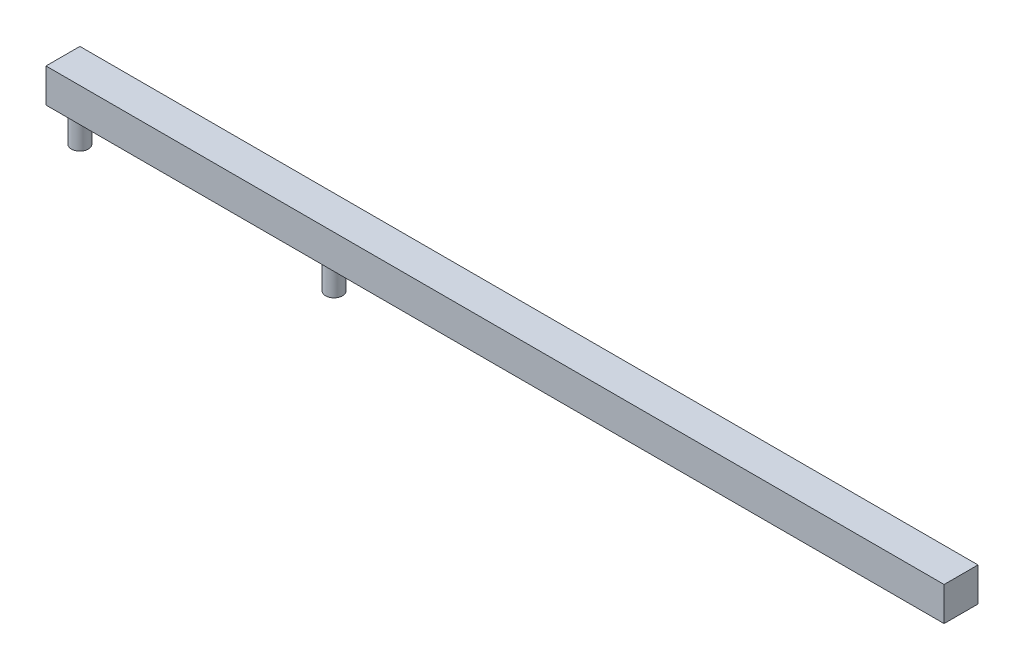
ISO-10303-21;
HEADER;
FILE_DESCRIPTION(('STEP AP214'),'2;1');
FILE_NAME('part.step','',(''),(''),'','','');
FILE_SCHEMA(('AUTOMOTIVE_DESIGN { 1 0 10303 214 1 1 1 1 }'));
ENDSEC;
DATA;
#1=APPLICATION_CONTEXT('core data for automotive mechanical design processes');
#2=APPLICATION_PROTOCOL_DEFINITION('international standard','automotive_design',2000,#1);
#3=PRODUCT_CONTEXT('',#1,'mechanical');
#4=PRODUCT('Part','Part','',(#3));
#5=PRODUCT_RELATED_PRODUCT_CATEGORY('part','',(#4));
#6=PRODUCT_DEFINITION_FORMATION('','',#4);
#7=PRODUCT_DEFINITION_CONTEXT('part definition',#1,'design');
#8=PRODUCT_DEFINITION('design','',#6,#7);
#9=PRODUCT_DEFINITION_SHAPE('','',#8);
#10=(LENGTH_UNIT() NAMED_UNIT(*) SI_UNIT(.MILLI.,.METRE.));
#11=(NAMED_UNIT(*) PLANE_ANGLE_UNIT() SI_UNIT($,.RADIAN.));
#12=(NAMED_UNIT(*) SI_UNIT($,.STERADIAN.) SOLID_ANGLE_UNIT());
#13=UNCERTAINTY_MEASURE_WITH_UNIT(LENGTH_MEASURE(1.E-05),#10,'distance_accuracy_value','');
#14=(GEOMETRIC_REPRESENTATION_CONTEXT(3) GLOBAL_UNCERTAINTY_ASSIGNED_CONTEXT((#13)) GLOBAL_UNIT_ASSIGNED_CONTEXT((#10,
#11,#12)) REPRESENTATION_CONTEXT('',''));
#15=CARTESIAN_POINT('',(0.,0.,0.));
#16=DIRECTION('',(0.,0.,1.));
#17=DIRECTION('',(1.,0.,0.));
#18=AXIS2_PLACEMENT_3D('',#15,#16,#17);
#19=CARTESIAN_POINT('',(0.,10.,0.));
#20=DIRECTION('',(-1.,0.,0.));
#21=DIRECTION('',(0.,0.,1.));
#22=AXIS2_PLACEMENT_3D('',#19,#20,#21);
#23=PLANE('',#22);
#24=DIRECTION('',(0.,0.,-1.));
#25=VECTOR('',#24,1.);
#26=CARTESIAN_POINT('',(0.,0.,0.));
#27=LINE('',#26,#25);
#28=CARTESIAN_POINT('',(0.,0.,10.));
#29=VERTEX_POINT('',#28);
#30=CARTESIAN_POINT('',(0.,0.,0.));
#31=VERTEX_POINT('',#30);
#32=EDGE_CURVE('E96',#29,#31,#27,.T.);
#33=ORIENTED_EDGE('',*,*,#32,.T.);
#34=DIRECTION('',(0.,-1.,0.));
#35=VECTOR('',#34,1.);
#36=CARTESIAN_POINT('',(0.,10.,0.));
#37=LINE('',#36,#35);
#38=CARTESIAN_POINT('',(0.,10.,0.));
#39=VERTEX_POINT('',#38);
#40=EDGE_CURVE('E11',#39,#31,#37,.T.);
#41=ORIENTED_EDGE('',*,*,#40,.F.);
#42=DIRECTION('',(0.,0.,-1.));
#43=VECTOR('',#42,1.);
#44=CARTESIAN_POINT('',(0.,10.,0.));
#45=LINE('',#44,#43);
#46=CARTESIAN_POINT('',(0.,10.,10.));
#47=VERTEX_POINT('',#46);
#48=EDGE_CURVE('E84',#47,#39,#45,.T.);
#49=ORIENTED_EDGE('',*,*,#48,.F.);
#50=DIRECTION('',(0.,-1.,0.));
#51=VECTOR('',#50,1.);
#52=CARTESIAN_POINT('',(0.,10.,10.));
#53=LINE('',#52,#51);
#54=EDGE_CURVE('E92',#47,#29,#53,.T.);
#55=ORIENTED_EDGE('',*,*,#54,.T.);
#56=EDGE_LOOP('',(#33,#41,#49,#55));
#57=FACE_BOUND('',#56,.T.);
#58=ADVANCED_FACE('F33',(#57),#23,.F.);
#59=CARTESIAN_POINT('',(0.,10.,0.));
#60=DIRECTION('',(0.,0.,1.));
#61=DIRECTION('',(1.,0.,0.));
#62=AXIS2_PLACEMENT_3D('',#59,#60,#61);
#63=PLANE('',#62);
#64=DIRECTION('',(-1.,0.,0.));
#65=VECTOR('',#64,1.);
#66=CARTESIAN_POINT('',(0.,0.,0.));
#67=LINE('',#66,#65);
#68=CARTESIAN_POINT('',(-265.,0.,0.));
#69=VERTEX_POINT('',#68);
#70=EDGE_CURVE('E88',#31,#69,#67,.T.);
#71=ORIENTED_EDGE('',*,*,#70,.T.);
#72=DIRECTION('',(0.,-1.,0.));
#73=VECTOR('',#72,1.);
#74=CARTESIAN_POINT('',(-265.,10.,0.));
#75=LINE('',#74,#73);
#76=CARTESIAN_POINT('',(-265.,10.,0.));
#77=VERTEX_POINT('',#76);
#78=EDGE_CURVE('E41',#77,#69,#75,.T.);
#79=ORIENTED_EDGE('',*,*,#78,.F.);
#80=DIRECTION('',(-1.,0.,0.));
#81=VECTOR('',#80,1.);
#82=CARTESIAN_POINT('',(0.,10.,0.));
#83=LINE('',#82,#81);
#84=EDGE_CURVE('E79',#39,#77,#83,.T.);
#85=ORIENTED_EDGE('',*,*,#84,.F.);
#86=ORIENTED_EDGE('',*,*,#40,.T.);
#87=EDGE_LOOP('',(#71,#79,#85,#86));
#88=FACE_BOUND('',#87,.T.);
#89=ADVANCED_FACE('F87',(#88),#63,.F.);
#90=CARTESIAN_POINT('',(-265.,10.,0.));
#91=DIRECTION('',(1.,0.,0.));
#92=DIRECTION('',(0.,0.,-1.));
#93=AXIS2_PLACEMENT_3D('',#90,#91,#92);
#94=PLANE('',#93);
#95=DIRECTION('',(0.,0.,1.));
#96=VECTOR('',#95,1.);
#97=CARTESIAN_POINT('',(-265.,0.,0.));
#98=LINE('',#97,#96);
#99=CARTESIAN_POINT('',(-265.,0.,10.));
#100=VERTEX_POINT('',#99);
#101=EDGE_CURVE('E66',#69,#100,#98,.T.);
#102=ORIENTED_EDGE('',*,*,#101,.T.);
#103=DIRECTION('',(0.,-1.,0.));
#104=VECTOR('',#103,1.);
#105=CARTESIAN_POINT('',(-265.,10.,10.));
#106=LINE('',#105,#104);
#107=CARTESIAN_POINT('',(-265.,10.,10.));
#108=VERTEX_POINT('',#107);
#109=EDGE_CURVE('E89',#108,#100,#106,.T.);
#110=ORIENTED_EDGE('',*,*,#109,.F.);
#111=DIRECTION('',(0.,0.,1.));
#112=VECTOR('',#111,1.);
#113=CARTESIAN_POINT('',(-265.,10.,0.));
#114=LINE('',#113,#112);
#115=EDGE_CURVE('E82',#77,#108,#114,.T.);
#116=ORIENTED_EDGE('',*,*,#115,.F.);
#117=ORIENTED_EDGE('',*,*,#78,.T.);
#118=EDGE_LOOP('',(#102,#110,#116,#117));
#119=FACE_BOUND('',#118,.T.);
#120=ADVANCED_FACE('F90',(#119),#94,.F.);
#121=CARTESIAN_POINT('',(0.,10.,10.));
#122=DIRECTION('',(0.,0.,-1.));
#123=DIRECTION('',(-1.,0.,0.));
#124=AXIS2_PLACEMENT_3D('',#121,#122,#123);
#125=PLANE('',#124);
#126=DIRECTION('',(1.,0.,0.));
#127=VECTOR('',#126,1.);
#128=CARTESIAN_POINT('',(0.,0.,10.));
#129=LINE('',#128,#127);
#130=EDGE_CURVE('E72',#100,#29,#129,.T.);
#131=ORIENTED_EDGE('',*,*,#130,.T.);
#132=ORIENTED_EDGE('',*,*,#54,.F.);
#133=DIRECTION('',(1.,0.,0.));
#134=VECTOR('',#133,1.);
#135=CARTESIAN_POINT('',(0.,10.,10.));
#136=LINE('',#135,#134);
#137=EDGE_CURVE('E49',#108,#47,#136,.T.);
#138=ORIENTED_EDGE('',*,*,#137,.F.);
#139=ORIENTED_EDGE('',*,*,#109,.T.);
#140=EDGE_LOOP('',(#131,#132,#138,#139));
#141=FACE_BOUND('',#140,.T.);
#142=ADVANCED_FACE('F104',(#141),#125,.F.);
#143=CARTESIAN_POINT('',(0.,10.,0.));
#144=DIRECTION('',(0.,-1.,0.));
#145=DIRECTION('',(0.,0.,-1.));
#146=AXIS2_PLACEMENT_3D('',#143,#144,#145);
#147=PLANE('',#146);
#148=ORIENTED_EDGE('',*,*,#48,.T.);
#149=ORIENTED_EDGE('',*,*,#84,.T.);
#150=ORIENTED_EDGE('',*,*,#115,.T.);
#151=ORIENTED_EDGE('',*,*,#137,.T.);
#152=EDGE_LOOP('',(#148,#149,#150,#151));
#153=FACE_BOUND('',#152,.T.);
#154=ADVANCED_FACE('F80',(#153),#147,.F.);
#155=CARTESIAN_POINT('',(0.,0.,0.));
#156=DIRECTION('',(0.,-1.,0.));
#157=DIRECTION('',(0.,0.,-1.));
#158=AXIS2_PLACEMENT_3D('',#155,#156,#157);
#159=PLANE('',#158);
#160=CARTESIAN_POINT('',(-185.,0.,4.99999999999998));
#161=DIRECTION('',(0.,-1.,0.));
#162=DIRECTION('',(0.,0.,-1.));
#163=AXIS2_PLACEMENT_3D('',#160,#161,#162);
#164=CIRCLE('',#163,2.5);
#165=CARTESIAN_POINT('',(-185.,0.,2.49999999999998));
#166=VERTEX_POINT('',#165);
#167=EDGE_CURVE('E116',#166,#166,#164,.T.);
#168=ORIENTED_EDGE('',*,*,#167,.F.);
#169=EDGE_LOOP('',(#168));
#170=FACE_BOUND('',#169,.T.);
#171=CARTESIAN_POINT('',(-260.,0.,4.99999999999997));
#172=DIRECTION('',(0.,-1.,0.));
#173=DIRECTION('',(0.,0.,-1.));
#174=AXIS2_PLACEMENT_3D('',#171,#172,#173);
#175=CIRCLE('',#174,2.50000000000002);
#176=CARTESIAN_POINT('',(-260.,0.,2.49999999999995));
#177=VERTEX_POINT('',#176);
#178=EDGE_CURVE('E110',#177,#177,#175,.T.);
#179=ORIENTED_EDGE('',*,*,#178,.F.);
#180=EDGE_LOOP('',(#179));
#181=FACE_BOUND('',#180,.T.);
#182=ORIENTED_EDGE('',*,*,#32,.F.);
#183=ORIENTED_EDGE('',*,*,#130,.F.);
#184=ORIENTED_EDGE('',*,*,#101,.F.);
#185=ORIENTED_EDGE('',*,*,#70,.F.);
#186=EDGE_LOOP('',(#182,#183,#184,#185));
#187=FACE_BOUND('',#186,.T.);
#188=ADVANCED_FACE('F107',(#170,#181,#187),#159,.T.);
#189=CARTESIAN_POINT('',(-260.,-10.,4.99999999999997));
#190=DIRECTION('',(0.,1.,0.));
#191=DIRECTION('',(0.,0.,1.));
#192=AXIS2_PLACEMENT_3D('',#189,#190,#191);
#193=CYLINDRICAL_SURFACE('',#192,2.50000000000002);
#194=CARTESIAN_POINT('',(-260.,-10.,4.99999999999997));
#195=DIRECTION('',(0.,-1.,0.));
#196=DIRECTION('',(0.,0.,-1.));
#197=AXIS2_PLACEMENT_3D('',#194,#195,#196);
#198=CIRCLE('',#197,2.50000000000002);
#199=CARTESIAN_POINT('',(-260.,-10.,2.49999999999995));
#200=VERTEX_POINT('',#199);
#201=EDGE_CURVE('E99',#200,#200,#198,.T.);
#202=ORIENTED_EDGE('',*,*,#201,.F.);
#203=EDGE_LOOP('',(#202));
#204=FACE_BOUND('',#203,.T.);
#205=ORIENTED_EDGE('',*,*,#178,.T.);
#206=EDGE_LOOP('',(#205));
#207=FACE_BOUND('',#206,.T.);
#208=ADVANCED_FACE('F133',(#204,#207),#193,.T.);
#209=CARTESIAN_POINT('',(-260.,-10.,4.99999999999997));
#210=DIRECTION('',(0.,-1.,0.));
#211=DIRECTION('',(0.,0.,-1.));
#212=AXIS2_PLACEMENT_3D('',#209,#210,#211);
#213=PLANE('',#212);
#214=ORIENTED_EDGE('',*,*,#201,.T.);
#215=EDGE_LOOP('',(#214));
#216=FACE_BOUND('',#215,.T.);
#217=ADVANCED_FACE('F127',(#216),#213,.T.);
#218=CARTESIAN_POINT('',(-185.,-10.,4.99999999999998));
#219=DIRECTION('',(0.,1.,0.));
#220=DIRECTION('',(0.,0.,1.));
#221=AXIS2_PLACEMENT_3D('',#218,#219,#220);
#222=CYLINDRICAL_SURFACE('',#221,2.5);
#223=CARTESIAN_POINT('',(-185.,-10.,4.99999999999998));
#224=DIRECTION('',(0.,-1.,0.));
#225=DIRECTION('',(0.,0.,-1.));
#226=AXIS2_PLACEMENT_3D('',#223,#224,#225);
#227=CIRCLE('',#226,2.5);
#228=CARTESIAN_POINT('',(-185.,-10.,2.49999999999998));
#229=VERTEX_POINT('',#228);
#230=EDGE_CURVE('E113',#229,#229,#227,.T.);
#231=ORIENTED_EDGE('',*,*,#230,.F.);
#232=EDGE_LOOP('',(#231));
#233=FACE_BOUND('',#232,.T.);
#234=ORIENTED_EDGE('',*,*,#167,.T.);
#235=EDGE_LOOP('',(#234));
#236=FACE_BOUND('',#235,.T.);
#237=ADVANCED_FACE('F124',(#233,#236),#222,.T.);
#238=CARTESIAN_POINT('',(-185.,-10.,4.99999999999998));
#239=DIRECTION('',(0.,-1.,0.));
#240=DIRECTION('',(0.,0.,-1.));
#241=AXIS2_PLACEMENT_3D('',#238,#239,#240);
#242=PLANE('',#241);
#243=ORIENTED_EDGE('',*,*,#230,.T.);
#244=EDGE_LOOP('',(#243));
#245=FACE_BOUND('',#244,.T.);
#246=ADVANCED_FACE('F122',(#245),#242,.T.);
#247=CLOSED_SHELL('',(#58,#89,#120,#142,#154,#188,#208,#217,#237,#246));
#248=MANIFOLD_SOLID_BREP('B2',#247);
#249=ADVANCED_BREP_SHAPE_REPRESENTATION('',(#18,#248),#14);
#250=SHAPE_DEFINITION_REPRESENTATION(#9,#249);
ENDSEC;
END-ISO-10303-21;
